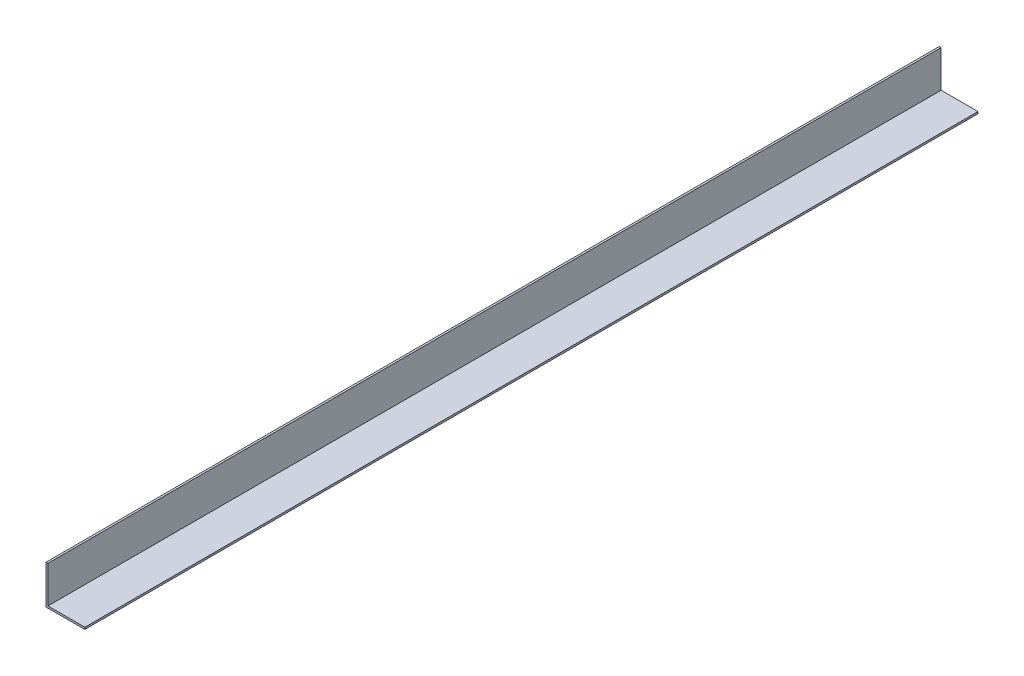
ISO-10303-21;
HEADER;
FILE_DESCRIPTION(('STEP AP214'),'2;1');
FILE_NAME('part.step','',(''),(''),'','','');
FILE_SCHEMA(('AUTOMOTIVE_DESIGN { 1 0 10303 214 1 1 1 1 }'));
ENDSEC;
DATA;
#1=APPLICATION_CONTEXT('core data for automotive mechanical design processes');
#2=APPLICATION_PROTOCOL_DEFINITION('international standard','automotive_design',2000,#1);
#3=PRODUCT_CONTEXT('',#1,'mechanical');
#4=PRODUCT('Part','Part','',(#3));
#5=PRODUCT_RELATED_PRODUCT_CATEGORY('part','',(#4));
#6=PRODUCT_DEFINITION_FORMATION('','',#4);
#7=PRODUCT_DEFINITION_CONTEXT('part definition',#1,'design');
#8=PRODUCT_DEFINITION('design','',#6,#7);
#9=PRODUCT_DEFINITION_SHAPE('','',#8);
#10=(LENGTH_UNIT() NAMED_UNIT(*) SI_UNIT(.MILLI.,.METRE.));
#11=(NAMED_UNIT(*) PLANE_ANGLE_UNIT() SI_UNIT($,.RADIAN.));
#12=(NAMED_UNIT(*) SI_UNIT($,.STERADIAN.) SOLID_ANGLE_UNIT());
#13=UNCERTAINTY_MEASURE_WITH_UNIT(LENGTH_MEASURE(1.E-05),#10,'distance_accuracy_value','');
#14=(GEOMETRIC_REPRESENTATION_CONTEXT(3) GLOBAL_UNCERTAINTY_ASSIGNED_CONTEXT((#13)) GLOBAL_UNIT_ASSIGNED_CONTEXT((#10,
#11,#12)) REPRESENTATION_CONTEXT('',''));
#15=CARTESIAN_POINT('',(0.,0.,0.));
#16=DIRECTION('',(0.,0.,1.));
#17=DIRECTION('',(1.,0.,0.));
#18=AXIS2_PLACEMENT_3D('',#15,#16,#17);
#19=CARTESIAN_POINT('',(20.,0.,460.));
#20=DIRECTION('',(0.,1.,0.));
#21=DIRECTION('',(-1.,0.,0.));
#22=AXIS2_PLACEMENT_3D('',#19,#20,#21);
#23=PLANE('',#22);
#24=DIRECTION('',(1.,0.,0.));
#25=VECTOR('',#24,1.);
#26=CARTESIAN_POINT('',(20.,0.,0.));
#27=LINE('',#26,#25);
#28=CARTESIAN_POINT('',(0.,0.,0.));
#29=VERTEX_POINT('',#28);
#30=CARTESIAN_POINT('',(20.,0.,0.));
#31=VERTEX_POINT('',#30);
#32=EDGE_CURVE('E119',#29,#31,#27,.T.);
#33=ORIENTED_EDGE('',*,*,#32,.T.);
#34=DIRECTION('',(0.,0.,-1.));
#35=VECTOR('',#34,1.);
#36=CARTESIAN_POINT('',(20.,0.,460.));
#37=LINE('',#36,#35);
#38=CARTESIAN_POINT('',(20.,0.,460.));
#39=VERTEX_POINT('',#38);
#40=EDGE_CURVE('E11',#39,#31,#37,.T.);
#41=ORIENTED_EDGE('',*,*,#40,.F.);
#42=DIRECTION('',(1.,0.,0.));
#43=VECTOR('',#42,1.);
#44=CARTESIAN_POINT('',(20.,0.,460.));
#45=LINE('',#44,#43);
#46=CARTESIAN_POINT('',(0.,0.,460.));
#47=VERTEX_POINT('',#46);
#48=EDGE_CURVE('E129',#47,#39,#45,.T.);
#49=ORIENTED_EDGE('',*,*,#48,.F.);
#50=DIRECTION('',(0.,0.,-1.));
#51=VECTOR('',#50,1.);
#52=CARTESIAN_POINT('',(0.,0.,460.));
#53=LINE('',#52,#51);
#54=EDGE_CURVE('E115',#47,#29,#53,.T.);
#55=ORIENTED_EDGE('',*,*,#54,.T.);
#56=EDGE_LOOP('',(#33,#41,#49,#55));
#57=FACE_BOUND('',#56,.T.);
#58=ADVANCED_FACE('F35',(#57),#23,.F.);
#59=CARTESIAN_POINT('',(20.,1.,460.));
#60=DIRECTION('',(-1.,0.,0.));
#61=DIRECTION('',(0.,0.,1.));
#62=AXIS2_PLACEMENT_3D('',#59,#60,#61);
#63=PLANE('',#62);
#64=DIRECTION('',(0.,1.,0.));
#65=VECTOR('',#64,1.);
#66=CARTESIAN_POINT('',(20.,1.,0.));
#67=LINE('',#66,#65);
#68=CARTESIAN_POINT('',(20.,1.,0.));
#69=VERTEX_POINT('',#68);
#70=EDGE_CURVE('E122',#31,#69,#67,.T.);
#71=ORIENTED_EDGE('',*,*,#70,.T.);
#72=DIRECTION('',(0.,0.,-1.));
#73=VECTOR('',#72,1.);
#74=CARTESIAN_POINT('',(20.,1.,460.));
#75=LINE('',#74,#73);
#76=CARTESIAN_POINT('',(20.,1.,460.));
#77=VERTEX_POINT('',#76);
#78=EDGE_CURVE('E43',#77,#69,#75,.T.);
#79=ORIENTED_EDGE('',*,*,#78,.F.);
#80=DIRECTION('',(0.,1.,0.));
#81=VECTOR('',#80,1.);
#82=CARTESIAN_POINT('',(20.,1.,460.));
#83=LINE('',#82,#81);
#84=EDGE_CURVE('E88',#39,#77,#83,.T.);
#85=ORIENTED_EDGE('',*,*,#84,.F.);
#86=ORIENTED_EDGE('',*,*,#40,.T.);
#87=EDGE_LOOP('',(#71,#79,#85,#86));
#88=FACE_BOUND('',#87,.T.);
#89=ADVANCED_FACE('F153',(#88),#63,.F.);
#90=CARTESIAN_POINT('',(1.,1.,460.));
#91=DIRECTION('',(0.,-1.,0.));
#92=DIRECTION('',(1.,0.,0.));
#93=AXIS2_PLACEMENT_3D('',#90,#91,#92);
#94=PLANE('',#93);
#95=DIRECTION('',(-1.,0.,0.));
#96=VECTOR('',#95,1.);
#97=CARTESIAN_POINT('',(1.,1.,0.));
#98=LINE('',#97,#96);
#99=CARTESIAN_POINT('',(1.,1.,0.));
#100=VERTEX_POINT('',#99);
#101=EDGE_CURVE('E124',#69,#100,#98,.T.);
#102=ORIENTED_EDGE('',*,*,#101,.T.);
#103=DIRECTION('',(0.,0.,-1.));
#104=VECTOR('',#103,1.);
#105=CARTESIAN_POINT('',(1.,1.,460.));
#106=LINE('',#105,#104);
#107=CARTESIAN_POINT('',(1.,1.,460.));
#108=VERTEX_POINT('',#107);
#109=EDGE_CURVE('E110',#108,#100,#106,.T.);
#110=ORIENTED_EDGE('',*,*,#109,.F.);
#111=DIRECTION('',(-1.,0.,0.));
#112=VECTOR('',#111,1.);
#113=CARTESIAN_POINT('',(1.,1.,460.));
#114=LINE('',#113,#112);
#115=EDGE_CURVE('E101',#77,#108,#114,.T.);
#116=ORIENTED_EDGE('',*,*,#115,.F.);
#117=ORIENTED_EDGE('',*,*,#78,.T.);
#118=EDGE_LOOP('',(#102,#110,#116,#117));
#119=FACE_BOUND('',#118,.T.);
#120=ADVANCED_FACE('F135',(#119),#94,.F.);
#121=CARTESIAN_POINT('',(1.,20.,460.));
#122=DIRECTION('',(-1.,0.,0.));
#123=DIRECTION('',(0.,-1.,0.));
#124=AXIS2_PLACEMENT_3D('',#121,#122,#123);
#125=PLANE('',#124);
#126=DIRECTION('',(0.,1.,0.));
#127=VECTOR('',#126,1.);
#128=CARTESIAN_POINT('',(1.,20.,0.));
#129=LINE('',#128,#127);
#130=CARTESIAN_POINT('',(1.,20.,0.));
#131=VERTEX_POINT('',#130);
#132=EDGE_CURVE('E109',#100,#131,#129,.T.);
#133=ORIENTED_EDGE('',*,*,#132,.T.);
#134=DIRECTION('',(0.,0.,-1.));
#135=VECTOR('',#134,1.);
#136=CARTESIAN_POINT('',(1.,20.,460.));
#137=LINE('',#136,#135);
#138=CARTESIAN_POINT('',(1.,20.,460.));
#139=VERTEX_POINT('',#138);
#140=EDGE_CURVE('E106',#139,#131,#137,.T.);
#141=ORIENTED_EDGE('',*,*,#140,.F.);
#142=DIRECTION('',(0.,1.,0.));
#143=VECTOR('',#142,1.);
#144=CARTESIAN_POINT('',(1.,20.,460.));
#145=LINE('',#144,#143);
#146=EDGE_CURVE('E95',#108,#139,#145,.T.);
#147=ORIENTED_EDGE('',*,*,#146,.F.);
#148=ORIENTED_EDGE('',*,*,#109,.T.);
#149=EDGE_LOOP('',(#133,#141,#147,#148));
#150=FACE_BOUND('',#149,.T.);
#151=ADVANCED_FACE('F107',(#150),#125,.F.);
#152=CARTESIAN_POINT('',(0.,20.,460.));
#153=DIRECTION('',(0.,-1.,0.));
#154=DIRECTION('',(0.,0.,-1.));
#155=AXIS2_PLACEMENT_3D('',#152,#153,#154);
#156=PLANE('',#155);
#157=DIRECTION('',(-1.,0.,0.));
#158=VECTOR('',#157,1.);
#159=CARTESIAN_POINT('',(0.,20.,0.));
#160=LINE('',#159,#158);
#161=CARTESIAN_POINT('',(0.,20.,0.));
#162=VERTEX_POINT('',#161);
#163=EDGE_CURVE('E74',#131,#162,#160,.T.);
#164=ORIENTED_EDGE('',*,*,#163,.T.);
#165=DIRECTION('',(0.,0.,-1.));
#166=VECTOR('',#165,1.);
#167=CARTESIAN_POINT('',(0.,20.,460.));
#168=LINE('',#167,#166);
#169=CARTESIAN_POINT('',(0.,20.,460.));
#170=VERTEX_POINT('',#169);
#171=EDGE_CURVE('E111',#170,#162,#168,.T.);
#172=ORIENTED_EDGE('',*,*,#171,.F.);
#173=DIRECTION('',(-1.,0.,0.));
#174=VECTOR('',#173,1.);
#175=CARTESIAN_POINT('',(0.,20.,460.));
#176=LINE('',#175,#174);
#177=EDGE_CURVE('E99',#139,#170,#176,.T.);
#178=ORIENTED_EDGE('',*,*,#177,.F.);
#179=ORIENTED_EDGE('',*,*,#140,.T.);
#180=EDGE_LOOP('',(#164,#172,#178,#179));
#181=FACE_BOUND('',#180,.T.);
#182=ADVANCED_FACE('F113',(#181),#156,.F.);
#183=CARTESIAN_POINT('',(0.,0.,460.));
#184=DIRECTION('',(1.,0.,0.));
#185=DIRECTION('',(0.,0.,-1.));
#186=AXIS2_PLACEMENT_3D('',#183,#184,#185);
#187=PLANE('',#186);
#188=DIRECTION('',(0.,-1.,0.));
#189=VECTOR('',#188,1.);
#190=CARTESIAN_POINT('',(0.,0.,0.));
#191=LINE('',#190,#189);
#192=EDGE_CURVE('E80',#162,#29,#191,.T.);
#193=ORIENTED_EDGE('',*,*,#192,.T.);
#194=ORIENTED_EDGE('',*,*,#54,.F.);
#195=DIRECTION('',(0.,-1.,0.));
#196=VECTOR('',#195,1.);
#197=CARTESIAN_POINT('',(0.,0.,460.));
#198=LINE('',#197,#196);
#199=EDGE_CURVE('E51',#170,#47,#198,.T.);
#200=ORIENTED_EDGE('',*,*,#199,.F.);
#201=ORIENTED_EDGE('',*,*,#171,.T.);
#202=EDGE_LOOP('',(#193,#194,#200,#201));
#203=FACE_BOUND('',#202,.T.);
#204=ADVANCED_FACE('F142',(#203),#187,.F.);
#205=CARTESIAN_POINT('',(0.,0.,460.));
#206=DIRECTION('',(0.,0.,-1.));
#207=DIRECTION('',(-1.,0.,0.));
#208=AXIS2_PLACEMENT_3D('',#205,#206,#207);
#209=PLANE('',#208);
#210=ORIENTED_EDGE('',*,*,#48,.T.);
#211=ORIENTED_EDGE('',*,*,#84,.T.);
#212=ORIENTED_EDGE('',*,*,#115,.T.);
#213=ORIENTED_EDGE('',*,*,#146,.T.);
#214=ORIENTED_EDGE('',*,*,#177,.T.);
#215=ORIENTED_EDGE('',*,*,#199,.T.);
#216=EDGE_LOOP('',(#210,#211,#212,#213,#214,#215));
#217=FACE_BOUND('',#216,.T.);
#218=ADVANCED_FACE('F97',(#217),#209,.F.);
#219=CARTESIAN_POINT('',(0.,0.,0.));
#220=DIRECTION('',(0.,0.,-1.));
#221=DIRECTION('',(-1.,0.,0.));
#222=AXIS2_PLACEMENT_3D('',#219,#220,#221);
#223=PLANE('',#222);
#224=ORIENTED_EDGE('',*,*,#32,.F.);
#225=ORIENTED_EDGE('',*,*,#192,.F.);
#226=ORIENTED_EDGE('',*,*,#163,.F.);
#227=ORIENTED_EDGE('',*,*,#132,.F.);
#228=ORIENTED_EDGE('',*,*,#101,.F.);
#229=ORIENTED_EDGE('',*,*,#70,.F.);
#230=EDGE_LOOP('',(#224,#225,#226,#227,#228,#229));
#231=FACE_BOUND('',#230,.T.);
#232=ADVANCED_FACE('F138',(#231),#223,.T.);
#233=CLOSED_SHELL('',(#58,#89,#120,#151,#182,#204,#218,#232));
#234=MANIFOLD_SOLID_BREP('B2',#233);
#235=ADVANCED_BREP_SHAPE_REPRESENTATION('',(#18,#234),#14);
#236=SHAPE_DEFINITION_REPRESENTATION(#9,#235);
ENDSEC;
END-ISO-10303-21;
